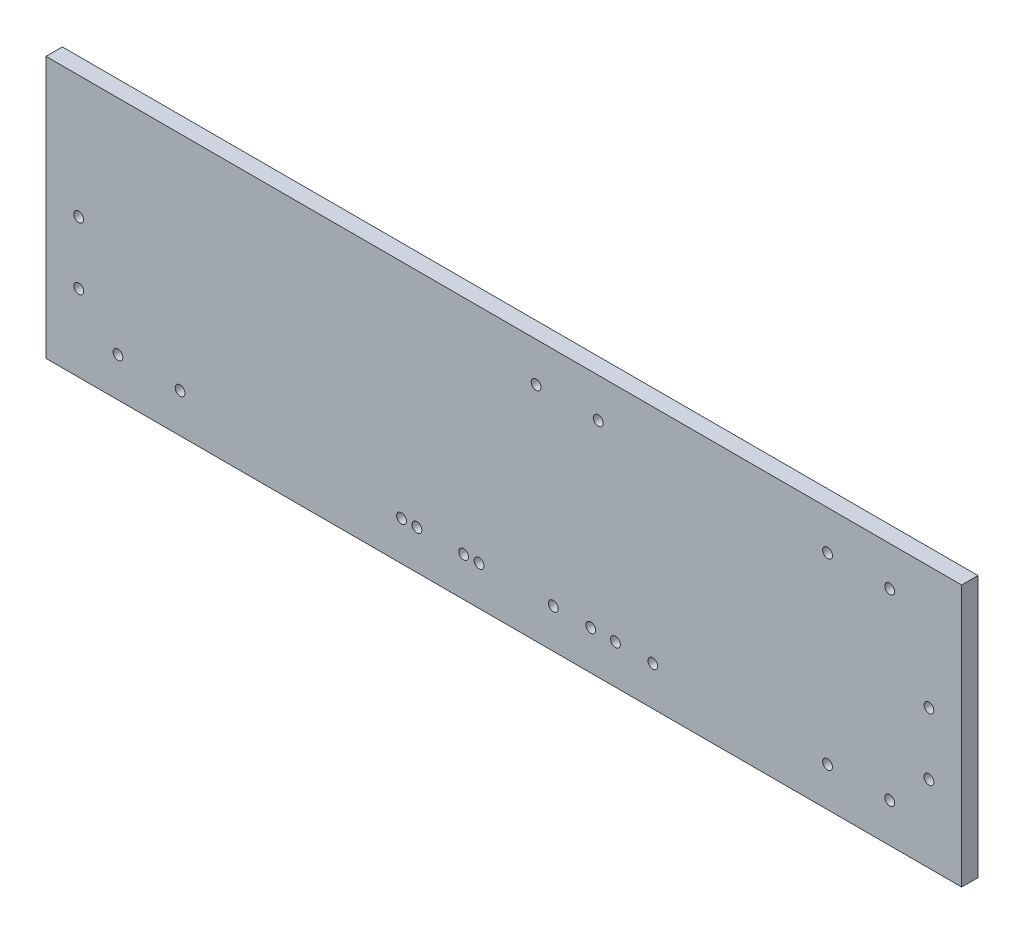
ISO-10303-21;
HEADER;
FILE_DESCRIPTION(('STEP AP214'),'2;1');
FILE_NAME('part.step','',(''),(''),'','','');
FILE_SCHEMA(('AUTOMOTIVE_DESIGN { 1 0 10303 214 1 1 1 1 }'));
ENDSEC;
DATA;
#1=APPLICATION_CONTEXT('core data for automotive mechanical design processes');
#2=APPLICATION_PROTOCOL_DEFINITION('international standard','automotive_design',2000,#1);
#3=PRODUCT_CONTEXT('',#1,'mechanical');
#4=PRODUCT('Part','Part','',(#3));
#5=PRODUCT_RELATED_PRODUCT_CATEGORY('part','',(#4));
#6=PRODUCT_DEFINITION_FORMATION('','',#4);
#7=PRODUCT_DEFINITION_CONTEXT('part definition',#1,'design');
#8=PRODUCT_DEFINITION('design','',#6,#7);
#9=PRODUCT_DEFINITION_SHAPE('','',#8);
#10=(LENGTH_UNIT() NAMED_UNIT(*) SI_UNIT(.MILLI.,.METRE.));
#11=(NAMED_UNIT(*) PLANE_ANGLE_UNIT() SI_UNIT($,.RADIAN.));
#12=(NAMED_UNIT(*) SI_UNIT($,.STERADIAN.) SOLID_ANGLE_UNIT());
#13=UNCERTAINTY_MEASURE_WITH_UNIT(LENGTH_MEASURE(1.E-05),#10,'distance_accuracy_value','');
#14=(GEOMETRIC_REPRESENTATION_CONTEXT(3) GLOBAL_UNCERTAINTY_ASSIGNED_CONTEXT((#13)) GLOBAL_UNIT_ASSIGNED_CONTEXT((#10,
#11,#12)) REPRESENTATION_CONTEXT('',''));
#15=CARTESIAN_POINT('',(0.,0.,0.));
#16=DIRECTION('',(0.,0.,1.));
#17=DIRECTION('',(1.,0.,0.));
#18=AXIS2_PLACEMENT_3D('',#15,#16,#17);
#19=CARTESIAN_POINT('',(0.,0.,6.35));
#20=DIRECTION('',(1.,0.,0.));
#21=DIRECTION('',(0.,0.,-1.));
#22=AXIS2_PLACEMENT_3D('',#19,#20,#21);
#23=PLANE('',#22);
#24=DIRECTION('',(0.,-1.,0.));
#25=VECTOR('',#24,1.);
#26=CARTESIAN_POINT('',(0.,0.,0.));
#27=LINE('',#26,#25);
#28=CARTESIAN_POINT('',(0.,101.6,0.));
#29=VERTEX_POINT('',#28);
#30=CARTESIAN_POINT('',(0.,0.,0.));
#31=VERTEX_POINT('',#30);
#32=EDGE_CURVE('E98',#29,#31,#27,.T.);
#33=ORIENTED_EDGE('',*,*,#32,.T.);
#34=DIRECTION('',(0.,0.,-1.));
#35=VECTOR('',#34,1.);
#36=CARTESIAN_POINT('',(0.,0.,6.35));
#37=LINE('',#36,#35);
#38=CARTESIAN_POINT('',(0.,0.,6.35));
#39=VERTEX_POINT('',#38);
#40=EDGE_CURVE('E11',#39,#31,#37,.T.);
#41=ORIENTED_EDGE('',*,*,#40,.F.);
#42=DIRECTION('',(0.,-1.,0.));
#43=VECTOR('',#42,1.);
#44=CARTESIAN_POINT('',(0.,0.,6.35));
#45=LINE('',#44,#43);
#46=CARTESIAN_POINT('',(0.,101.6,6.35));
#47=VERTEX_POINT('',#46);
#48=EDGE_CURVE('E86',#47,#39,#45,.T.);
#49=ORIENTED_EDGE('',*,*,#48,.F.);
#50=DIRECTION('',(0.,0.,-1.));
#51=VECTOR('',#50,1.);
#52=CARTESIAN_POINT('',(0.,101.6,6.35));
#53=LINE('',#52,#51);
#54=EDGE_CURVE('E94',#47,#29,#53,.T.);
#55=ORIENTED_EDGE('',*,*,#54,.T.);
#56=EDGE_LOOP('',(#33,#41,#49,#55));
#57=FACE_BOUND('',#56,.T.);
#58=ADVANCED_FACE('F35',(#57),#23,.F.);
#59=CARTESIAN_POINT('',(0.,0.,6.35));
#60=DIRECTION('',(0.,1.,0.));
#61=DIRECTION('',(0.,0.,1.));
#62=AXIS2_PLACEMENT_3D('',#59,#60,#61);
#63=PLANE('',#62);
#64=DIRECTION('',(1.,0.,0.));
#65=VECTOR('',#64,1.);
#66=CARTESIAN_POINT('',(0.,0.,0.));
#67=LINE('',#66,#65);
#68=CARTESIAN_POINT('',(355.6,0.,0.));
#69=VERTEX_POINT('',#68);
#70=EDGE_CURVE('E90',#31,#69,#67,.T.);
#71=ORIENTED_EDGE('',*,*,#70,.T.);
#72=DIRECTION('',(0.,0.,-1.));
#73=VECTOR('',#72,1.);
#74=CARTESIAN_POINT('',(355.6,0.,6.35));
#75=LINE('',#74,#73);
#76=CARTESIAN_POINT('',(355.6,0.,6.35));
#77=VERTEX_POINT('',#76);
#78=EDGE_CURVE('E43',#77,#69,#75,.T.);
#79=ORIENTED_EDGE('',*,*,#78,.F.);
#80=DIRECTION('',(1.,0.,0.));
#81=VECTOR('',#80,1.);
#82=CARTESIAN_POINT('',(0.,0.,6.35));
#83=LINE('',#82,#81);
#84=EDGE_CURVE('E81',#39,#77,#83,.T.);
#85=ORIENTED_EDGE('',*,*,#84,.F.);
#86=ORIENTED_EDGE('',*,*,#40,.T.);
#87=EDGE_LOOP('',(#71,#79,#85,#86));
#88=FACE_BOUND('',#87,.T.);
#89=ADVANCED_FACE('F89',(#88),#63,.F.);
#90=CARTESIAN_POINT('',(355.6,0.,6.35));
#91=DIRECTION('',(-1.,0.,0.));
#92=DIRECTION('',(0.,0.,1.));
#93=AXIS2_PLACEMENT_3D('',#90,#91,#92);
#94=PLANE('',#93);
#95=DIRECTION('',(0.,1.,0.));
#96=VECTOR('',#95,1.);
#97=CARTESIAN_POINT('',(355.6,0.,0.));
#98=LINE('',#97,#96);
#99=CARTESIAN_POINT('',(355.6,101.6,0.));
#100=VERTEX_POINT('',#99);
#101=EDGE_CURVE('E68',#69,#100,#98,.T.);
#102=ORIENTED_EDGE('',*,*,#101,.T.);
#103=DIRECTION('',(0.,0.,-1.));
#104=VECTOR('',#103,1.);
#105=CARTESIAN_POINT('',(355.6,101.6,6.35));
#106=LINE('',#105,#104);
#107=CARTESIAN_POINT('',(355.6,101.6,6.35));
#108=VERTEX_POINT('',#107);
#109=EDGE_CURVE('E91',#108,#100,#106,.T.);
#110=ORIENTED_EDGE('',*,*,#109,.F.);
#111=DIRECTION('',(0.,1.,0.));
#112=VECTOR('',#111,1.);
#113=CARTESIAN_POINT('',(355.6,0.,6.35));
#114=LINE('',#113,#112);
#115=EDGE_CURVE('E84',#77,#108,#114,.T.);
#116=ORIENTED_EDGE('',*,*,#115,.F.);
#117=ORIENTED_EDGE('',*,*,#78,.T.);
#118=EDGE_LOOP('',(#102,#110,#116,#117));
#119=FACE_BOUND('',#118,.T.);
#120=ADVANCED_FACE('F92',(#119),#94,.F.);
#121=CARTESIAN_POINT('',(0.,101.6,6.35));
#122=DIRECTION('',(0.,-1.,0.));
#123=DIRECTION('',(0.,0.,-1.));
#124=AXIS2_PLACEMENT_3D('',#121,#122,#123);
#125=PLANE('',#124);
#126=DIRECTION('',(-1.,0.,0.));
#127=VECTOR('',#126,1.);
#128=CARTESIAN_POINT('',(0.,101.6,0.));
#129=LINE('',#128,#127);
#130=EDGE_CURVE('E74',#100,#29,#129,.T.);
#131=ORIENTED_EDGE('',*,*,#130,.T.);
#132=ORIENTED_EDGE('',*,*,#54,.F.);
#133=DIRECTION('',(-1.,0.,0.));
#134=VECTOR('',#133,1.);
#135=CARTESIAN_POINT('',(0.,101.6,6.35));
#136=LINE('',#135,#134);
#137=EDGE_CURVE('E51',#108,#47,#136,.T.);
#138=ORIENTED_EDGE('',*,*,#137,.F.);
#139=ORIENTED_EDGE('',*,*,#109,.T.);
#140=EDGE_LOOP('',(#131,#132,#138,#139));
#141=FACE_BOUND('',#140,.T.);
#142=ADVANCED_FACE('F106',(#141),#125,.F.);
#143=CARTESIAN_POINT('',(0.,0.,6.35));
#144=DIRECTION('',(0.,0.,-1.));
#145=DIRECTION('',(-1.,0.,0.));
#146=AXIS2_PLACEMENT_3D('',#143,#144,#145);
#147=PLANE('',#146);
#148=CARTESIAN_POINT('',(190.330582,86.36,6.35));
#149=DIRECTION('',(0.,0.,1.));
#150=DIRECTION('',(1.,0.,0.));
#151=AXIS2_PLACEMENT_3D('',#148,#149,#150);
#152=CIRCLE('',#151,1.90499999999999);
#153=CARTESIAN_POINT('',(192.235582,86.36,6.35));
#154=VERTEX_POINT('',#153);
#155=EDGE_CURVE('E228',#154,#154,#152,.T.);
#156=ORIENTED_EDGE('',*,*,#155,.F.);
#157=EDGE_LOOP('',(#156));
#158=FACE_BOUND('',#157,.T.);
#159=CARTESIAN_POINT('',(214.460582,86.36,6.35));
#160=DIRECTION('',(0.,0.,1.));
#161=DIRECTION('',(1.,0.,0.));
#162=AXIS2_PLACEMENT_3D('',#159,#160,#161);
#163=CIRCLE('',#162,1.90499999999999);
#164=CARTESIAN_POINT('',(216.365582,86.36,6.35));
#165=VERTEX_POINT('',#164);
#166=EDGE_CURVE('E222',#165,#165,#163,.T.);
#167=ORIENTED_EDGE('',*,*,#166,.F.);
#168=EDGE_LOOP('',(#167));
#169=FACE_BOUND('',#168,.T.);
#170=CARTESIAN_POINT('',(303.53,86.36,6.35));
#171=DIRECTION('',(0.,0.,1.));
#172=DIRECTION('',(1.,0.,0.));
#173=AXIS2_PLACEMENT_3D('',#170,#171,#172);
#174=CIRCLE('',#173,1.90499999999999);
#175=CARTESIAN_POINT('',(305.435,86.36,6.35));
#176=VERTEX_POINT('',#175);
#177=EDGE_CURVE('E216',#176,#176,#174,.T.);
#178=ORIENTED_EDGE('',*,*,#177,.F.);
#179=EDGE_LOOP('',(#178));
#180=FACE_BOUND('',#179,.T.);
#181=CARTESIAN_POINT('',(327.66,86.36,6.35));
#182=DIRECTION('',(0.,0.,1.));
#183=DIRECTION('',(1.,0.,0.));
#184=AXIS2_PLACEMENT_3D('',#181,#182,#183);
#185=CIRCLE('',#184,1.90499999999999);
#186=CARTESIAN_POINT('',(329.565,86.36,6.35));
#187=VERTEX_POINT('',#186);
#188=EDGE_CURVE('E210',#187,#187,#185,.T.);
#189=ORIENTED_EDGE('',*,*,#188,.F.);
#190=EDGE_LOOP('',(#189));
#191=FACE_BOUND('',#190,.T.);
#192=CARTESIAN_POINT('',(197.031356,15.24,6.35));
#193=DIRECTION('',(0.,0.,1.));
#194=DIRECTION('',(1.,0.,0.));
#195=AXIS2_PLACEMENT_3D('',#192,#193,#194);
#196=CIRCLE('',#195,1.90499999999999);
#197=CARTESIAN_POINT('',(198.936356,15.24,6.35));
#198=VERTEX_POINT('',#197);
#199=EDGE_CURVE('E204',#198,#198,#196,.T.);
#200=ORIENTED_EDGE('',*,*,#199,.F.);
#201=EDGE_LOOP('',(#200));
#202=FACE_BOUND('',#201,.T.);
#203=CARTESIAN_POINT('',(221.161356,15.24,6.35));
#204=DIRECTION('',(0.,0.,1.));
#205=DIRECTION('',(1.,0.,0.));
#206=AXIS2_PLACEMENT_3D('',#203,#204,#205);
#207=CIRCLE('',#206,1.90499999999999);
#208=CARTESIAN_POINT('',(223.066356,15.24,6.35));
#209=VERTEX_POINT('',#208);
#210=EDGE_CURVE('E198',#209,#209,#207,.T.);
#211=ORIENTED_EDGE('',*,*,#210,.F.);
#212=EDGE_LOOP('',(#211));
#213=FACE_BOUND('',#212,.T.);
#214=CARTESIAN_POINT('',(211.545678,15.24,6.35));
#215=DIRECTION('',(0.,0.,1.));
#216=DIRECTION('',(1.,0.,0.));
#217=AXIS2_PLACEMENT_3D('',#214,#215,#216);
#218=CIRCLE('',#217,1.90499999999999);
#219=CARTESIAN_POINT('',(213.450678,15.24,6.35));
#220=VERTEX_POINT('',#219);
#221=EDGE_CURVE('E192',#220,#220,#218,.T.);
#222=ORIENTED_EDGE('',*,*,#221,.F.);
#223=EDGE_LOOP('',(#222));
#224=FACE_BOUND('',#223,.T.);
#225=CARTESIAN_POINT('',(235.675678,15.24,6.35));
#226=DIRECTION('',(0.,0.,1.));
#227=DIRECTION('',(1.,0.,0.));
#228=AXIS2_PLACEMENT_3D('',#225,#226,#227);
#229=CIRCLE('',#228,1.90499999999999);
#230=CARTESIAN_POINT('',(237.580678,15.24,6.35));
#231=VERTEX_POINT('',#230);
#232=EDGE_CURVE('E186',#231,#231,#229,.T.);
#233=ORIENTED_EDGE('',*,*,#232,.F.);
#234=EDGE_LOOP('',(#233));
#235=FACE_BOUND('',#234,.T.);
#236=CARTESIAN_POINT('',(303.53,15.24,6.35));
#237=DIRECTION('',(0.,0.,1.));
#238=DIRECTION('',(1.,0.,0.));
#239=AXIS2_PLACEMENT_3D('',#236,#237,#238);
#240=CIRCLE('',#239,1.90499999999999);
#241=CARTESIAN_POINT('',(305.435,15.24,6.35));
#242=VERTEX_POINT('',#241);
#243=EDGE_CURVE('E180',#242,#242,#240,.T.);
#244=ORIENTED_EDGE('',*,*,#243,.F.);
#245=EDGE_LOOP('',(#244));
#246=FACE_BOUND('',#245,.T.);
#247=CARTESIAN_POINT('',(327.66,15.24,6.35));
#248=DIRECTION('',(0.,0.,1.));
#249=DIRECTION('',(1.,0.,0.));
#250=AXIS2_PLACEMENT_3D('',#247,#248,#249);
#251=CIRCLE('',#250,1.90499999999999);
#252=CARTESIAN_POINT('',(329.565,15.24,6.35));
#253=VERTEX_POINT('',#252);
#254=EDGE_CURVE('E174',#253,#253,#251,.T.);
#255=ORIENTED_EDGE('',*,*,#254,.F.);
#256=EDGE_LOOP('',(#255));
#257=FACE_BOUND('',#256,.T.);
#258=CARTESIAN_POINT('',(144.04467,15.24,6.35));
#259=DIRECTION('',(0.,0.,1.));
#260=DIRECTION('',(1.,0.,0.));
#261=AXIS2_PLACEMENT_3D('',#258,#259,#260);
#262=CIRCLE('',#261,1.905);
#263=CARTESIAN_POINT('',(145.94967,15.24,6.35));
#264=VERTEX_POINT('',#263);
#265=EDGE_CURVE('E168',#264,#264,#262,.T.);
#266=ORIENTED_EDGE('',*,*,#265,.F.);
#267=EDGE_LOOP('',(#266));
#268=FACE_BOUND('',#267,.T.);
#269=CARTESIAN_POINT('',(168.17467,15.24,6.35));
#270=DIRECTION('',(0.,0.,1.));
#271=DIRECTION('',(1.,0.,0.));
#272=AXIS2_PLACEMENT_3D('',#269,#270,#271);
#273=CIRCLE('',#272,1.905);
#274=CARTESIAN_POINT('',(170.07967,15.24,6.35));
#275=VERTEX_POINT('',#274);
#276=EDGE_CURVE('E162',#275,#275,#273,.T.);
#277=ORIENTED_EDGE('',*,*,#276,.F.);
#278=EDGE_LOOP('',(#277));
#279=FACE_BOUND('',#278,.T.);
#280=CARTESIAN_POINT('',(138.067034,15.24,6.35));
#281=DIRECTION('',(0.,0.,1.));
#282=DIRECTION('',(1.,0.,0.));
#283=AXIS2_PLACEMENT_3D('',#280,#281,#282);
#284=CIRCLE('',#283,1.905);
#285=CARTESIAN_POINT('',(139.972034,15.24,6.35));
#286=VERTEX_POINT('',#285);
#287=EDGE_CURVE('E156',#286,#286,#284,.T.);
#288=ORIENTED_EDGE('',*,*,#287,.F.);
#289=EDGE_LOOP('',(#288));
#290=FACE_BOUND('',#289,.T.);
#291=CARTESIAN_POINT('',(162.197034,15.24,6.35));
#292=DIRECTION('',(0.,0.,1.));
#293=DIRECTION('',(1.,0.,0.));
#294=AXIS2_PLACEMENT_3D('',#291,#292,#293);
#295=CIRCLE('',#294,1.905);
#296=CARTESIAN_POINT('',(164.102034,15.24,6.35));
#297=VERTEX_POINT('',#296);
#298=EDGE_CURVE('E150',#297,#297,#295,.T.);
#299=ORIENTED_EDGE('',*,*,#298,.F.);
#300=EDGE_LOOP('',(#299));
#301=FACE_BOUND('',#300,.T.);
#302=CARTESIAN_POINT('',(12.7,53.975,6.35));
#303=DIRECTION('',(0.,0.,1.));
#304=DIRECTION('',(1.,0.,0.));
#305=AXIS2_PLACEMENT_3D('',#302,#303,#304);
#306=CIRCLE('',#305,1.905);
#307=CARTESIAN_POINT('',(14.605,53.975,6.35));
#308=VERTEX_POINT('',#307);
#309=EDGE_CURVE('E141',#308,#308,#306,.T.);
#310=ORIENTED_EDGE('',*,*,#309,.F.);
#311=EDGE_LOOP('',(#310));
#312=FACE_BOUND('',#311,.T.);
#313=CARTESIAN_POINT('',(342.9,29.8450000000003,6.35));
#314=DIRECTION('',(0.,0.,1.));
#315=DIRECTION('',(-1.,0.,0.));
#316=AXIS2_PLACEMENT_3D('',#313,#314,#315);
#317=CIRCLE('',#316,1.90499999999999);
#318=CARTESIAN_POINT('',(340.995,29.8450000000003,6.35));
#319=VERTEX_POINT('',#318);
#320=EDGE_CURVE('E133',#319,#319,#317,.T.);
#321=ORIENTED_EDGE('',*,*,#320,.F.);
#322=EDGE_LOOP('',(#321));
#323=FACE_BOUND('',#322,.T.);
#324=CARTESIAN_POINT('',(342.9,53.975,6.35));
#325=DIRECTION('',(0.,0.,1.));
#326=DIRECTION('',(-1.,0.,0.));
#327=AXIS2_PLACEMENT_3D('',#324,#325,#326);
#328=CIRCLE('',#327,1.90499999999999);
#329=CARTESIAN_POINT('',(340.995,53.975,6.35));
#330=VERTEX_POINT('',#329);
#331=EDGE_CURVE('E134',#330,#330,#328,.T.);
#332=ORIENTED_EDGE('',*,*,#331,.F.);
#333=EDGE_LOOP('',(#332));
#334=FACE_BOUND('',#333,.T.);
#335=CARTESIAN_POINT('',(12.7,29.845,6.35));
#336=DIRECTION('',(0.,0.,1.));
#337=DIRECTION('',(1.,0.,0.));
#338=AXIS2_PLACEMENT_3D('',#335,#336,#337);
#339=CIRCLE('',#338,1.905);
#340=CARTESIAN_POINT('',(14.605,29.845,6.35));
#341=VERTEX_POINT('',#340);
#342=EDGE_CURVE('E126',#341,#341,#339,.T.);
#343=ORIENTED_EDGE('',*,*,#342,.F.);
#344=EDGE_LOOP('',(#343));
#345=FACE_BOUND('',#344,.T.);
#346=CARTESIAN_POINT('',(27.94,15.24,6.35));
#347=DIRECTION('',(0.,0.,1.));
#348=DIRECTION('',(1.,0.,0.));
#349=AXIS2_PLACEMENT_3D('',#346,#347,#348);
#350=CIRCLE('',#349,1.905);
#351=CARTESIAN_POINT('',(29.845,15.24,6.35));
#352=VERTEX_POINT('',#351);
#353=EDGE_CURVE('E117',#352,#352,#350,.T.);
#354=ORIENTED_EDGE('',*,*,#353,.F.);
#355=EDGE_LOOP('',(#354));
#356=FACE_BOUND('',#355,.T.);
#357=CARTESIAN_POINT('',(52.07,15.24,6.35));
#358=DIRECTION('',(0.,0.,1.));
#359=DIRECTION('',(1.,0.,0.));
#360=AXIS2_PLACEMENT_3D('',#357,#358,#359);
#361=CIRCLE('',#360,1.905);
#362=CARTESIAN_POINT('',(53.975,15.24,6.35));
#363=VERTEX_POINT('',#362);
#364=EDGE_CURVE('E114',#363,#363,#361,.T.);
#365=ORIENTED_EDGE('',*,*,#364,.F.);
#366=EDGE_LOOP('',(#365));
#367=FACE_BOUND('',#366,.T.);
#368=ORIENTED_EDGE('',*,*,#48,.T.);
#369=ORIENTED_EDGE('',*,*,#84,.T.);
#370=ORIENTED_EDGE('',*,*,#115,.T.);
#371=ORIENTED_EDGE('',*,*,#137,.T.);
#372=EDGE_LOOP('',(#368,#369,#370,#371));
#373=FACE_BOUND('',#372,.T.);
#374=ADVANCED_FACE('F82',(#158,#169,#180,#191,#202,#213,#224,#235,#246,#257,#268,#279,#290,#301,
#312,#323,#334,#345,#356,#367,#373),#147,.F.);
#375=CARTESIAN_POINT('',(0.,0.,0.));
#376=DIRECTION('',(0.,0.,-1.));
#377=DIRECTION('',(-1.,0.,0.));
#378=AXIS2_PLACEMENT_3D('',#375,#376,#377);
#379=PLANE('',#378);
#380=CARTESIAN_POINT('',(190.330582,86.36,0.));
#381=DIRECTION('',(0.,0.,-1.));
#382=DIRECTION('',(-1.,0.,0.));
#383=AXIS2_PLACEMENT_3D('',#380,#381,#382);
#384=CIRCLE('',#383,1.90499999999999);
#385=CARTESIAN_POINT('',(188.425582,86.36,0.));
#386=VERTEX_POINT('',#385);
#387=EDGE_CURVE('E225',#386,#386,#384,.F.);
#388=ORIENTED_EDGE('',*,*,#387,.T.);
#389=EDGE_LOOP('',(#388));
#390=FACE_BOUND('',#389,.T.);
#391=CARTESIAN_POINT('',(214.460582,86.36,0.));
#392=DIRECTION('',(0.,0.,-1.));
#393=DIRECTION('',(-1.,0.,0.));
#394=AXIS2_PLACEMENT_3D('',#391,#392,#393);
#395=CIRCLE('',#394,1.90499999999999);
#396=CARTESIAN_POINT('',(212.555582,86.36,0.));
#397=VERTEX_POINT('',#396);
#398=EDGE_CURVE('E219',#397,#397,#395,.F.);
#399=ORIENTED_EDGE('',*,*,#398,.T.);
#400=EDGE_LOOP('',(#399));
#401=FACE_BOUND('',#400,.T.);
#402=CARTESIAN_POINT('',(303.53,86.36,0.));
#403=DIRECTION('',(0.,0.,-1.));
#404=DIRECTION('',(-1.,0.,0.));
#405=AXIS2_PLACEMENT_3D('',#402,#403,#404);
#406=CIRCLE('',#405,1.90499999999999);
#407=CARTESIAN_POINT('',(301.625,86.36,0.));
#408=VERTEX_POINT('',#407);
#409=EDGE_CURVE('E213',#408,#408,#406,.F.);
#410=ORIENTED_EDGE('',*,*,#409,.T.);
#411=EDGE_LOOP('',(#410));
#412=FACE_BOUND('',#411,.T.);
#413=CARTESIAN_POINT('',(327.66,86.36,0.));
#414=DIRECTION('',(0.,0.,-1.));
#415=DIRECTION('',(-1.,0.,0.));
#416=AXIS2_PLACEMENT_3D('',#413,#414,#415);
#417=CIRCLE('',#416,1.90499999999999);
#418=CARTESIAN_POINT('',(325.755,86.36,0.));
#419=VERTEX_POINT('',#418);
#420=EDGE_CURVE('E207',#419,#419,#417,.F.);
#421=ORIENTED_EDGE('',*,*,#420,.T.);
#422=EDGE_LOOP('',(#421));
#423=FACE_BOUND('',#422,.T.);
#424=CARTESIAN_POINT('',(197.031356,15.24,0.));
#425=DIRECTION('',(0.,0.,-1.));
#426=DIRECTION('',(-1.,0.,0.));
#427=AXIS2_PLACEMENT_3D('',#424,#425,#426);
#428=CIRCLE('',#427,1.90499999999999);
#429=CARTESIAN_POINT('',(195.126356,15.24,0.));
#430=VERTEX_POINT('',#429);
#431=EDGE_CURVE('E201',#430,#430,#428,.F.);
#432=ORIENTED_EDGE('',*,*,#431,.T.);
#433=EDGE_LOOP('',(#432));
#434=FACE_BOUND('',#433,.T.);
#435=CARTESIAN_POINT('',(221.161356,15.24,0.));
#436=DIRECTION('',(0.,0.,-1.));
#437=DIRECTION('',(-1.,0.,0.));
#438=AXIS2_PLACEMENT_3D('',#435,#436,#437);
#439=CIRCLE('',#438,1.90499999999999);
#440=CARTESIAN_POINT('',(219.256356,15.24,0.));
#441=VERTEX_POINT('',#440);
#442=EDGE_CURVE('E195',#441,#441,#439,.F.);
#443=ORIENTED_EDGE('',*,*,#442,.T.);
#444=EDGE_LOOP('',(#443));
#445=FACE_BOUND('',#444,.T.);
#446=CARTESIAN_POINT('',(211.545678,15.24,0.));
#447=DIRECTION('',(0.,0.,-1.));
#448=DIRECTION('',(-1.,0.,0.));
#449=AXIS2_PLACEMENT_3D('',#446,#447,#448);
#450=CIRCLE('',#449,1.90499999999999);
#451=CARTESIAN_POINT('',(209.640678,15.24,0.));
#452=VERTEX_POINT('',#451);
#453=EDGE_CURVE('E189',#452,#452,#450,.F.);
#454=ORIENTED_EDGE('',*,*,#453,.T.);
#455=EDGE_LOOP('',(#454));
#456=FACE_BOUND('',#455,.T.);
#457=CARTESIAN_POINT('',(235.675678,15.24,0.));
#458=DIRECTION('',(0.,0.,-1.));
#459=DIRECTION('',(-1.,0.,0.));
#460=AXIS2_PLACEMENT_3D('',#457,#458,#459);
#461=CIRCLE('',#460,1.90499999999999);
#462=CARTESIAN_POINT('',(233.770678,15.24,0.));
#463=VERTEX_POINT('',#462);
#464=EDGE_CURVE('E183',#463,#463,#461,.F.);
#465=ORIENTED_EDGE('',*,*,#464,.T.);
#466=EDGE_LOOP('',(#465));
#467=FACE_BOUND('',#466,.T.);
#468=CARTESIAN_POINT('',(303.53,15.24,0.));
#469=DIRECTION('',(0.,0.,-1.));
#470=DIRECTION('',(-1.,0.,0.));
#471=AXIS2_PLACEMENT_3D('',#468,#469,#470);
#472=CIRCLE('',#471,1.90499999999999);
#473=CARTESIAN_POINT('',(301.625,15.24,0.));
#474=VERTEX_POINT('',#473);
#475=EDGE_CURVE('E177',#474,#474,#472,.F.);
#476=ORIENTED_EDGE('',*,*,#475,.T.);
#477=EDGE_LOOP('',(#476));
#478=FACE_BOUND('',#477,.T.);
#479=CARTESIAN_POINT('',(327.66,15.24,0.));
#480=DIRECTION('',(0.,0.,-1.));
#481=DIRECTION('',(-1.,0.,0.));
#482=AXIS2_PLACEMENT_3D('',#479,#480,#481);
#483=CIRCLE('',#482,1.90499999999999);
#484=CARTESIAN_POINT('',(325.755,15.24,0.));
#485=VERTEX_POINT('',#484);
#486=EDGE_CURVE('E171',#485,#485,#483,.F.);
#487=ORIENTED_EDGE('',*,*,#486,.T.);
#488=EDGE_LOOP('',(#487));
#489=FACE_BOUND('',#488,.T.);
#490=CARTESIAN_POINT('',(144.04467,15.24,0.));
#491=DIRECTION('',(0.,0.,-1.));
#492=DIRECTION('',(-1.,0.,0.));
#493=AXIS2_PLACEMENT_3D('',#490,#491,#492);
#494=CIRCLE('',#493,1.905);
#495=CARTESIAN_POINT('',(142.13967,15.24,0.));
#496=VERTEX_POINT('',#495);
#497=EDGE_CURVE('E165',#496,#496,#494,.F.);
#498=ORIENTED_EDGE('',*,*,#497,.T.);
#499=EDGE_LOOP('',(#498));
#500=FACE_BOUND('',#499,.T.);
#501=CARTESIAN_POINT('',(168.17467,15.24,0.));
#502=DIRECTION('',(0.,0.,-1.));
#503=DIRECTION('',(-1.,0.,0.));
#504=AXIS2_PLACEMENT_3D('',#501,#502,#503);
#505=CIRCLE('',#504,1.905);
#506=CARTESIAN_POINT('',(166.26967,15.24,0.));
#507=VERTEX_POINT('',#506);
#508=EDGE_CURVE('E159',#507,#507,#505,.F.);
#509=ORIENTED_EDGE('',*,*,#508,.T.);
#510=EDGE_LOOP('',(#509));
#511=FACE_BOUND('',#510,.T.);
#512=CARTESIAN_POINT('',(138.067034,15.24,0.));
#513=DIRECTION('',(0.,0.,-1.));
#514=DIRECTION('',(-1.,0.,0.));
#515=AXIS2_PLACEMENT_3D('',#512,#513,#514);
#516=CIRCLE('',#515,1.905);
#517=CARTESIAN_POINT('',(136.162034,15.24,0.));
#518=VERTEX_POINT('',#517);
#519=EDGE_CURVE('E153',#518,#518,#516,.F.);
#520=ORIENTED_EDGE('',*,*,#519,.T.);
#521=EDGE_LOOP('',(#520));
#522=FACE_BOUND('',#521,.T.);
#523=CARTESIAN_POINT('',(162.197034,15.24,0.));
#524=DIRECTION('',(0.,0.,-1.));
#525=DIRECTION('',(-1.,0.,0.));
#526=AXIS2_PLACEMENT_3D('',#523,#524,#525);
#527=CIRCLE('',#526,1.905);
#528=CARTESIAN_POINT('',(160.292034,15.24,0.));
#529=VERTEX_POINT('',#528);
#530=EDGE_CURVE('E137',#529,#529,#527,.F.);
#531=ORIENTED_EDGE('',*,*,#530,.T.);
#532=EDGE_LOOP('',(#531));
#533=FACE_BOUND('',#532,.T.);
#534=CARTESIAN_POINT('',(12.7,53.975,0.));
#535=DIRECTION('',(0.,0.,-1.));
#536=DIRECTION('',(-1.,0.,0.));
#537=AXIS2_PLACEMENT_3D('',#534,#535,#536);
#538=CIRCLE('',#537,1.905);
#539=CARTESIAN_POINT('',(10.795,53.975,0.));
#540=VERTEX_POINT('',#539);
#541=EDGE_CURVE('E129',#540,#540,#538,.F.);
#542=ORIENTED_EDGE('',*,*,#541,.T.);
#543=EDGE_LOOP('',(#542));
#544=FACE_BOUND('',#543,.T.);
#545=CARTESIAN_POINT('',(342.9,29.8450000000003,0.));
#546=DIRECTION('',(0.,0.,-1.));
#547=DIRECTION('',(-1.,0.,0.));
#548=AXIS2_PLACEMENT_3D('',#545,#546,#547);
#549=CIRCLE('',#548,1.90499999999999);
#550=CARTESIAN_POINT('',(340.995,29.8450000000003,0.));
#551=VERTEX_POINT('',#550);
#552=EDGE_CURVE('E138',#551,#551,#549,.F.);
#553=ORIENTED_EDGE('',*,*,#552,.T.);
#554=EDGE_LOOP('',(#553));
#555=FACE_BOUND('',#554,.T.);
#556=CARTESIAN_POINT('',(342.9,53.975,0.));
#557=DIRECTION('',(0.,0.,-1.));
#558=DIRECTION('',(-1.,0.,0.));
#559=AXIS2_PLACEMENT_3D('',#556,#557,#558);
#560=CIRCLE('',#559,1.90499999999999);
#561=CARTESIAN_POINT('',(340.995,53.975,0.));
#562=VERTEX_POINT('',#561);
#563=EDGE_CURVE('E130',#562,#562,#560,.F.);
#564=ORIENTED_EDGE('',*,*,#563,.T.);
#565=EDGE_LOOP('',(#564));
#566=FACE_BOUND('',#565,.T.);
#567=CARTESIAN_POINT('',(12.7,29.845,0.));
#568=DIRECTION('',(0.,0.,-1.));
#569=DIRECTION('',(-1.,0.,0.));
#570=AXIS2_PLACEMENT_3D('',#567,#568,#569);
#571=CIRCLE('',#570,1.905);
#572=CARTESIAN_POINT('',(10.795,29.845,0.));
#573=VERTEX_POINT('',#572);
#574=EDGE_CURVE('E123',#573,#573,#571,.F.);
#575=ORIENTED_EDGE('',*,*,#574,.T.);
#576=EDGE_LOOP('',(#575));
#577=FACE_BOUND('',#576,.T.);
#578=CARTESIAN_POINT('',(27.94,15.24,0.));
#579=DIRECTION('',(0.,0.,-1.));
#580=DIRECTION('',(-1.,0.,0.));
#581=AXIS2_PLACEMENT_3D('',#578,#579,#580);
#582=CIRCLE('',#581,1.905);
#583=CARTESIAN_POINT('',(26.035,15.24,0.));
#584=VERTEX_POINT('',#583);
#585=EDGE_CURVE('E120',#584,#584,#582,.F.);
#586=ORIENTED_EDGE('',*,*,#585,.T.);
#587=EDGE_LOOP('',(#586));
#588=FACE_BOUND('',#587,.T.);
#589=CARTESIAN_POINT('',(52.07,15.24,0.));
#590=DIRECTION('',(0.,0.,-1.));
#591=DIRECTION('',(-1.,0.,0.));
#592=AXIS2_PLACEMENT_3D('',#589,#590,#591);
#593=CIRCLE('',#592,1.905);
#594=CARTESIAN_POINT('',(50.165,15.24,0.));
#595=VERTEX_POINT('',#594);
#596=EDGE_CURVE('E101',#595,#595,#593,.F.);
#597=ORIENTED_EDGE('',*,*,#596,.T.);
#598=EDGE_LOOP('',(#597));
#599=FACE_BOUND('',#598,.T.);
#600=ORIENTED_EDGE('',*,*,#32,.F.);
#601=ORIENTED_EDGE('',*,*,#130,.F.);
#602=ORIENTED_EDGE('',*,*,#101,.F.);
#603=ORIENTED_EDGE('',*,*,#70,.F.);
#604=EDGE_LOOP('',(#600,#601,#602,#603));
#605=FACE_BOUND('',#604,.T.);
#606=ADVANCED_FACE('F109',(#390,#401,#412,#423,#434,#445,#456,#467,#478,#489,#500,#511,#522,
#533,#544,#555,#566,#577,#588,#599,#605),#379,.T.);
#607=CARTESIAN_POINT('',(52.07,15.24,-5.38815367264149));
#608=DIRECTION('',(0.,0.,1.));
#609=DIRECTION('',(1.,0.,0.));
#610=AXIS2_PLACEMENT_3D('',#607,#608,#609);
#611=CYLINDRICAL_SURFACE('',#610,1.905);
#612=ORIENTED_EDGE('',*,*,#364,.T.);
#613=EDGE_LOOP('',(#612));
#614=FACE_BOUND('',#613,.T.);
#615=ORIENTED_EDGE('',*,*,#596,.F.);
#616=EDGE_LOOP('',(#615));
#617=FACE_BOUND('',#616,.T.);
#618=ADVANCED_FACE('F276',(#614,#617),#611,.F.);
#619=CARTESIAN_POINT('',(27.94,15.24,-5.38815367264149));
#620=DIRECTION('',(0.,0.,1.));
#621=DIRECTION('',(1.,0.,0.));
#622=AXIS2_PLACEMENT_3D('',#619,#620,#621);
#623=CYLINDRICAL_SURFACE('',#622,1.905);
#624=ORIENTED_EDGE('',*,*,#353,.T.);
#625=EDGE_LOOP('',(#624));
#626=FACE_BOUND('',#625,.T.);
#627=ORIENTED_EDGE('',*,*,#585,.F.);
#628=EDGE_LOOP('',(#627));
#629=FACE_BOUND('',#628,.T.);
#630=ADVANCED_FACE('F279',(#626,#629),#623,.F.);
#631=CARTESIAN_POINT('',(12.7,29.845,-5.38815367264149));
#632=DIRECTION('',(0.,0.,1.));
#633=DIRECTION('',(1.,0.,0.));
#634=AXIS2_PLACEMENT_3D('',#631,#632,#633);
#635=CYLINDRICAL_SURFACE('',#634,1.905);
#636=ORIENTED_EDGE('',*,*,#342,.T.);
#637=EDGE_LOOP('',(#636));
#638=FACE_BOUND('',#637,.T.);
#639=ORIENTED_EDGE('',*,*,#574,.F.);
#640=EDGE_LOOP('',(#639));
#641=FACE_BOUND('',#640,.T.);
#642=ADVANCED_FACE('F399',(#638,#641),#635,.F.);
#643=CARTESIAN_POINT('',(342.9,53.975,-5.38815367264149));
#644=DIRECTION('',(0.,0.,1.));
#645=DIRECTION('',(1.,0.,0.));
#646=AXIS2_PLACEMENT_3D('',#643,#644,#645);
#647=CYLINDRICAL_SURFACE('',#646,1.90499999999999);
#648=ORIENTED_EDGE('',*,*,#331,.T.);
#649=EDGE_LOOP('',(#648));
#650=FACE_BOUND('',#649,.T.);
#651=ORIENTED_EDGE('',*,*,#563,.F.);
#652=EDGE_LOOP('',(#651));
#653=FACE_BOUND('',#652,.T.);
#654=ADVANCED_FACE('F395',(#650,#653),#647,.F.);
#655=CARTESIAN_POINT('',(342.9,29.8450000000003,-5.38815367264149));
#656=DIRECTION('',(0.,0.,1.));
#657=DIRECTION('',(1.,0.,0.));
#658=AXIS2_PLACEMENT_3D('',#655,#656,#657);
#659=CYLINDRICAL_SURFACE('',#658,1.90499999999999);
#660=ORIENTED_EDGE('',*,*,#320,.T.);
#661=EDGE_LOOP('',(#660));
#662=FACE_BOUND('',#661,.T.);
#663=ORIENTED_EDGE('',*,*,#552,.F.);
#664=EDGE_LOOP('',(#663));
#665=FACE_BOUND('',#664,.T.);
#666=ADVANCED_FACE('F391',(#662,#665),#659,.F.);
#667=CARTESIAN_POINT('',(12.7,53.975,-5.38815367264149));
#668=DIRECTION('',(0.,0.,1.));
#669=DIRECTION('',(1.,0.,0.));
#670=AXIS2_PLACEMENT_3D('',#667,#668,#669);
#671=CYLINDRICAL_SURFACE('',#670,1.905);
#672=ORIENTED_EDGE('',*,*,#309,.T.);
#673=EDGE_LOOP('',(#672));
#674=FACE_BOUND('',#673,.T.);
#675=ORIENTED_EDGE('',*,*,#541,.F.);
#676=EDGE_LOOP('',(#675));
#677=FACE_BOUND('',#676,.T.);
#678=ADVANCED_FACE('F387',(#674,#677),#671,.F.);
#679=CARTESIAN_POINT('',(162.197034,15.24,-5.38815367264148));
#680=DIRECTION('',(0.,0.,1.));
#681=DIRECTION('',(1.,0.,0.));
#682=AXIS2_PLACEMENT_3D('',#679,#680,#681);
#683=CYLINDRICAL_SURFACE('',#682,1.905);
#684=ORIENTED_EDGE('',*,*,#298,.T.);
#685=EDGE_LOOP('',(#684));
#686=FACE_BOUND('',#685,.T.);
#687=ORIENTED_EDGE('',*,*,#530,.F.);
#688=EDGE_LOOP('',(#687));
#689=FACE_BOUND('',#688,.T.);
#690=ADVANCED_FACE('F383',(#686,#689),#683,.F.);
#691=CARTESIAN_POINT('',(138.067034,15.24,-5.38815367264148));
#692=DIRECTION('',(0.,0.,1.));
#693=DIRECTION('',(1.,0.,0.));
#694=AXIS2_PLACEMENT_3D('',#691,#692,#693);
#695=CYLINDRICAL_SURFACE('',#694,1.905);
#696=ORIENTED_EDGE('',*,*,#287,.T.);
#697=EDGE_LOOP('',(#696));
#698=FACE_BOUND('',#697,.T.);
#699=ORIENTED_EDGE('',*,*,#519,.F.);
#700=EDGE_LOOP('',(#699));
#701=FACE_BOUND('',#700,.T.);
#702=ADVANCED_FACE('F379',(#698,#701),#695,.F.);
#703=CARTESIAN_POINT('',(168.17467,15.24,-5.38815367264148));
#704=DIRECTION('',(0.,0.,1.));
#705=DIRECTION('',(1.,0.,0.));
#706=AXIS2_PLACEMENT_3D('',#703,#704,#705);
#707=CYLINDRICAL_SURFACE('',#706,1.905);
#708=ORIENTED_EDGE('',*,*,#276,.T.);
#709=EDGE_LOOP('',(#708));
#710=FACE_BOUND('',#709,.T.);
#711=ORIENTED_EDGE('',*,*,#508,.F.);
#712=EDGE_LOOP('',(#711));
#713=FACE_BOUND('',#712,.T.);
#714=ADVANCED_FACE('F375',(#710,#713),#707,.F.);
#715=CARTESIAN_POINT('',(144.04467,15.24,-5.38815367264148));
#716=DIRECTION('',(0.,0.,1.));
#717=DIRECTION('',(1.,0.,0.));
#718=AXIS2_PLACEMENT_3D('',#715,#716,#717);
#719=CYLINDRICAL_SURFACE('',#718,1.905);
#720=ORIENTED_EDGE('',*,*,#265,.T.);
#721=EDGE_LOOP('',(#720));
#722=FACE_BOUND('',#721,.T.);
#723=ORIENTED_EDGE('',*,*,#497,.F.);
#724=EDGE_LOOP('',(#723));
#725=FACE_BOUND('',#724,.T.);
#726=ADVANCED_FACE('F371',(#722,#725),#719,.F.);
#727=CARTESIAN_POINT('',(327.66,15.24,-5.38815367264147));
#728=DIRECTION('',(0.,0.,1.));
#729=DIRECTION('',(1.,0.,0.));
#730=AXIS2_PLACEMENT_3D('',#727,#728,#729);
#731=CYLINDRICAL_SURFACE('',#730,1.90499999999999);
#732=ORIENTED_EDGE('',*,*,#254,.T.);
#733=EDGE_LOOP('',(#732));
#734=FACE_BOUND('',#733,.T.);
#735=ORIENTED_EDGE('',*,*,#486,.F.);
#736=EDGE_LOOP('',(#735));
#737=FACE_BOUND('',#736,.T.);
#738=ADVANCED_FACE('F367',(#734,#737),#731,.F.);
#739=CARTESIAN_POINT('',(303.53,15.24,-5.38815367264147));
#740=DIRECTION('',(0.,0.,1.));
#741=DIRECTION('',(1.,0.,0.));
#742=AXIS2_PLACEMENT_3D('',#739,#740,#741);
#743=CYLINDRICAL_SURFACE('',#742,1.90499999999999);
#744=ORIENTED_EDGE('',*,*,#243,.T.);
#745=EDGE_LOOP('',(#744));
#746=FACE_BOUND('',#745,.T.);
#747=ORIENTED_EDGE('',*,*,#475,.F.);
#748=EDGE_LOOP('',(#747));
#749=FACE_BOUND('',#748,.T.);
#750=ADVANCED_FACE('F363',(#746,#749),#743,.F.);
#751=CARTESIAN_POINT('',(235.675678,15.24,-5.38815367264147));
#752=DIRECTION('',(0.,0.,1.));
#753=DIRECTION('',(1.,0.,0.));
#754=AXIS2_PLACEMENT_3D('',#751,#752,#753);
#755=CYLINDRICAL_SURFACE('',#754,1.90499999999999);
#756=ORIENTED_EDGE('',*,*,#232,.T.);
#757=EDGE_LOOP('',(#756));
#758=FACE_BOUND('',#757,.T.);
#759=ORIENTED_EDGE('',*,*,#464,.F.);
#760=EDGE_LOOP('',(#759));
#761=FACE_BOUND('',#760,.T.);
#762=ADVANCED_FACE('F359',(#758,#761),#755,.F.);
#763=CARTESIAN_POINT('',(211.545678,15.24,-5.38815367264147));
#764=DIRECTION('',(0.,0.,1.));
#765=DIRECTION('',(1.,0.,0.));
#766=AXIS2_PLACEMENT_3D('',#763,#764,#765);
#767=CYLINDRICAL_SURFACE('',#766,1.90499999999999);
#768=ORIENTED_EDGE('',*,*,#221,.T.);
#769=EDGE_LOOP('',(#768));
#770=FACE_BOUND('',#769,.T.);
#771=ORIENTED_EDGE('',*,*,#453,.F.);
#772=EDGE_LOOP('',(#771));
#773=FACE_BOUND('',#772,.T.);
#774=ADVANCED_FACE('F355',(#770,#773),#767,.F.);
#775=CARTESIAN_POINT('',(221.161356,15.24,-5.38815367264147));
#776=DIRECTION('',(0.,0.,1.));
#777=DIRECTION('',(1.,0.,0.));
#778=AXIS2_PLACEMENT_3D('',#775,#776,#777);
#779=CYLINDRICAL_SURFACE('',#778,1.90499999999999);
#780=ORIENTED_EDGE('',*,*,#210,.T.);
#781=EDGE_LOOP('',(#780));
#782=FACE_BOUND('',#781,.T.);
#783=ORIENTED_EDGE('',*,*,#442,.F.);
#784=EDGE_LOOP('',(#783));
#785=FACE_BOUND('',#784,.T.);
#786=ADVANCED_FACE('F351',(#782,#785),#779,.F.);
#787=CARTESIAN_POINT('',(197.031356,15.24,-5.38815367264147));
#788=DIRECTION('',(0.,0.,1.));
#789=DIRECTION('',(1.,0.,0.));
#790=AXIS2_PLACEMENT_3D('',#787,#788,#789);
#791=CYLINDRICAL_SURFACE('',#790,1.90499999999999);
#792=ORIENTED_EDGE('',*,*,#199,.T.);
#793=EDGE_LOOP('',(#792));
#794=FACE_BOUND('',#793,.T.);
#795=ORIENTED_EDGE('',*,*,#431,.F.);
#796=EDGE_LOOP('',(#795));
#797=FACE_BOUND('',#796,.T.);
#798=ADVANCED_FACE('F347',(#794,#797),#791,.F.);
#799=CARTESIAN_POINT('',(327.66,86.36,-5.38815367264146));
#800=DIRECTION('',(0.,0.,1.));
#801=DIRECTION('',(1.,0.,0.));
#802=AXIS2_PLACEMENT_3D('',#799,#800,#801);
#803=CYLINDRICAL_SURFACE('',#802,1.90499999999999);
#804=ORIENTED_EDGE('',*,*,#188,.T.);
#805=EDGE_LOOP('',(#804));
#806=FACE_BOUND('',#805,.T.);
#807=ORIENTED_EDGE('',*,*,#420,.F.);
#808=EDGE_LOOP('',(#807));
#809=FACE_BOUND('',#808,.T.);
#810=ADVANCED_FACE('F343',(#806,#809),#803,.F.);
#811=CARTESIAN_POINT('',(303.53,86.36,-5.38815367264146));
#812=DIRECTION('',(0.,0.,1.));
#813=DIRECTION('',(1.,0.,0.));
#814=AXIS2_PLACEMENT_3D('',#811,#812,#813);
#815=CYLINDRICAL_SURFACE('',#814,1.90499999999999);
#816=ORIENTED_EDGE('',*,*,#177,.T.);
#817=EDGE_LOOP('',(#816));
#818=FACE_BOUND('',#817,.T.);
#819=ORIENTED_EDGE('',*,*,#409,.F.);
#820=EDGE_LOOP('',(#819));
#821=FACE_BOUND('',#820,.T.);
#822=ADVANCED_FACE('F314',(#818,#821),#815,.F.);
#823=CARTESIAN_POINT('',(214.460582,86.36,-5.38815367264146));
#824=DIRECTION('',(0.,0.,1.));
#825=DIRECTION('',(1.,0.,0.));
#826=AXIS2_PLACEMENT_3D('',#823,#824,#825);
#827=CYLINDRICAL_SURFACE('',#826,1.90499999999999);
#828=ORIENTED_EDGE('',*,*,#166,.T.);
#829=EDGE_LOOP('',(#828));
#830=FACE_BOUND('',#829,.T.);
#831=ORIENTED_EDGE('',*,*,#398,.F.);
#832=EDGE_LOOP('',(#831));
#833=FACE_BOUND('',#832,.T.);
#834=ADVANCED_FACE('F324',(#830,#833),#827,.F.);
#835=CARTESIAN_POINT('',(190.330582,86.36,-5.38815367264146));
#836=DIRECTION('',(0.,0.,1.));
#837=DIRECTION('',(1.,0.,0.));
#838=AXIS2_PLACEMENT_3D('',#835,#836,#837);
#839=CYLINDRICAL_SURFACE('',#838,1.90499999999999);
#840=ORIENTED_EDGE('',*,*,#155,.T.);
#841=EDGE_LOOP('',(#840));
#842=FACE_BOUND('',#841,.T.);
#843=ORIENTED_EDGE('',*,*,#387,.F.);
#844=EDGE_LOOP('',(#843));
#845=FACE_BOUND('',#844,.T.);
#846=ADVANCED_FACE('F232',(#842,#845),#839,.F.);
#847=CLOSED_SHELL('',(#58,#89,#120,#142,#374,#606,#618,#630,#642,#654,#666,#678,#690,#702,#714,
#726,#738,#750,#762,#774,#786,#798,#810,#822,#834,#846));
#848=MANIFOLD_SOLID_BREP('B2',#847);
#849=ADVANCED_BREP_SHAPE_REPRESENTATION('',(#18,#848),#14);
#850=SHAPE_DEFINITION_REPRESENTATION(#9,#849);
ENDSEC;
END-ISO-10303-21;
